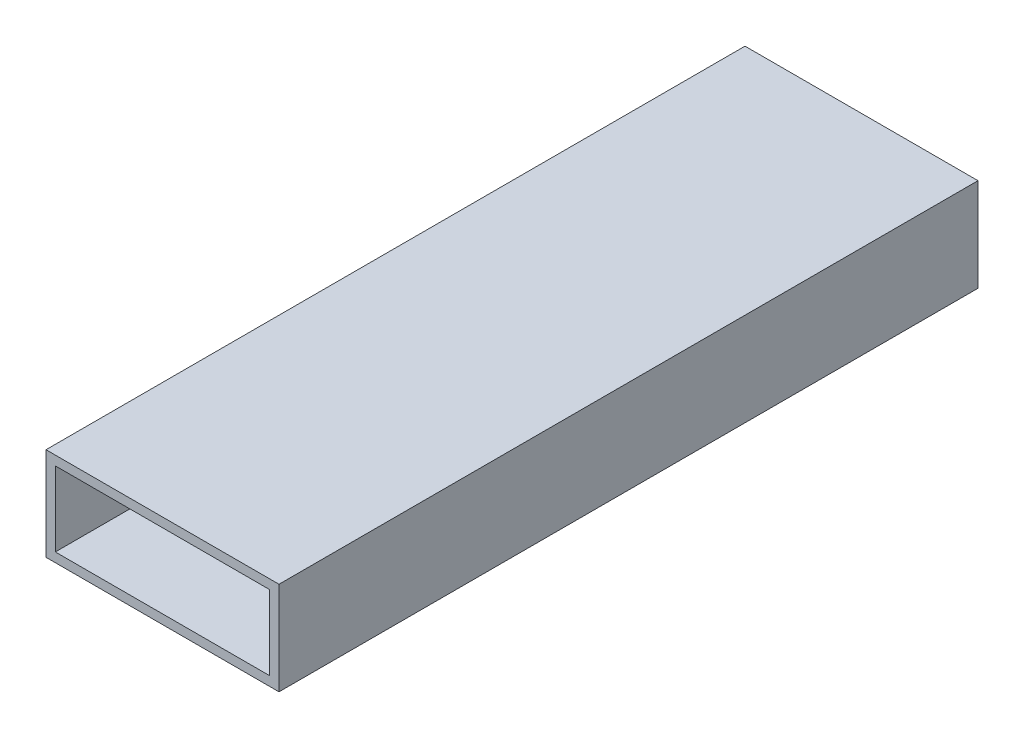
ISO-10303-21;
HEADER;
FILE_DESCRIPTION(('STEP AP214'),'2;1');
FILE_NAME('part.step','',(''),(''),'','','');
FILE_SCHEMA(('AUTOMOTIVE_DESIGN { 1 0 10303 214 1 1 1 1 }'));
ENDSEC;
DATA;
#1=APPLICATION_CONTEXT('core data for automotive mechanical design processes');
#2=APPLICATION_PROTOCOL_DEFINITION('international standard','automotive_design',2000,#1);
#3=PRODUCT_CONTEXT('',#1,'mechanical');
#4=PRODUCT('Part','Part','',(#3));
#5=PRODUCT_RELATED_PRODUCT_CATEGORY('part','',(#4));
#6=PRODUCT_DEFINITION_FORMATION('','',#4);
#7=PRODUCT_DEFINITION_CONTEXT('part definition',#1,'design');
#8=PRODUCT_DEFINITION('design','',#6,#7);
#9=PRODUCT_DEFINITION_SHAPE('','',#8);
#10=(LENGTH_UNIT() NAMED_UNIT(*) SI_UNIT(.MILLI.,.METRE.));
#11=(NAMED_UNIT(*) PLANE_ANGLE_UNIT() SI_UNIT($,.RADIAN.));
#12=(NAMED_UNIT(*) SI_UNIT($,.STERADIAN.) SOLID_ANGLE_UNIT());
#13=UNCERTAINTY_MEASURE_WITH_UNIT(LENGTH_MEASURE(1.E-05),#10,'distance_accuracy_value','');
#14=(GEOMETRIC_REPRESENTATION_CONTEXT(3) GLOBAL_UNCERTAINTY_ASSIGNED_CONTEXT((#13)) GLOBAL_UNIT_ASSIGNED_CONTEXT((#10,
#11,#12)) REPRESENTATION_CONTEXT('',''));
#15=CARTESIAN_POINT('',(0.,0.,0.));
#16=DIRECTION('',(0.,0.,1.));
#17=DIRECTION('',(1.,0.,0.));
#18=AXIS2_PLACEMENT_3D('',#15,#16,#17);
#19=CARTESIAN_POINT('',(0.,0.,150.));
#20=DIRECTION('',(0.,0.,-1.));
#21=DIRECTION('',(-1.,0.,0.));
#22=AXIS2_PLACEMENT_3D('',#19,#20,#21);
#23=PLANE('',#22);
#24=DIRECTION('',(0.,-1.,0.));
#25=VECTOR('',#24,1.);
#26=CARTESIAN_POINT('',(0.,0.,150.));
#27=LINE('',#26,#25);
#28=CARTESIAN_POINT('',(0.,20.,150.));
#29=VERTEX_POINT('',#28);
#30=CARTESIAN_POINT('',(0.,0.,150.));
#31=VERTEX_POINT('',#30);
#32=EDGE_CURVE('E136',#29,#31,#27,.T.);
#33=ORIENTED_EDGE('',*,*,#32,.T.);
#34=DIRECTION('',(1.,0.,0.));
#35=VECTOR('',#34,1.);
#36=CARTESIAN_POINT('',(0.,0.,150.));
#37=LINE('',#36,#35);
#38=CARTESIAN_POINT('',(50.,0.,150.));
#39=VERTEX_POINT('',#38);
#40=EDGE_CURVE('E139',#31,#39,#37,.T.);
#41=ORIENTED_EDGE('',*,*,#40,.T.);
#42=DIRECTION('',(0.,1.,0.));
#43=VECTOR('',#42,1.);
#44=CARTESIAN_POINT('',(50.,0.,150.));
#45=LINE('',#44,#43);
#46=CARTESIAN_POINT('',(50.,20.,150.));
#47=VERTEX_POINT('',#46);
#48=EDGE_CURVE('E142',#39,#47,#45,.T.);
#49=ORIENTED_EDGE('',*,*,#48,.T.);
#50=DIRECTION('',(-1.,0.,0.));
#51=VECTOR('',#50,1.);
#52=CARTESIAN_POINT('',(0.,20.,150.));
#53=LINE('',#52,#51);
#54=EDGE_CURVE('E144',#47,#29,#53,.T.);
#55=ORIENTED_EDGE('',*,*,#54,.T.);
#56=EDGE_LOOP('',(#33,#41,#49,#55));
#57=FACE_BOUND('',#56,.T.);
#58=DIRECTION('',(0.,-1.,0.));
#59=VECTOR('',#58,1.);
#60=CARTESIAN_POINT('',(2.,0.,150.));
#61=LINE('',#60,#59);
#62=CARTESIAN_POINT('',(1.99999999999999,18.,150.));
#63=VERTEX_POINT('',#62);
#64=CARTESIAN_POINT('',(2.,2.,150.));
#65=VERTEX_POINT('',#64);
#66=EDGE_CURVE('E124',#63,#65,#61,.T.);
#67=ORIENTED_EDGE('',*,*,#66,.F.);
#68=DIRECTION('',(-1.,0.,0.));
#69=VECTOR('',#68,1.);
#70=CARTESIAN_POINT('',(0.,18.,150.));
#71=LINE('',#70,#69);
#72=CARTESIAN_POINT('',(48.,18.,150.));
#73=VERTEX_POINT('',#72);
#74=EDGE_CURVE('E109',#73,#63,#71,.T.);
#75=ORIENTED_EDGE('',*,*,#74,.F.);
#76=DIRECTION('',(0.,1.,0.));
#77=VECTOR('',#76,1.);
#78=CARTESIAN_POINT('',(48.,0.,150.));
#79=LINE('',#78,#77);
#80=CARTESIAN_POINT('',(48.,2.,150.));
#81=VERTEX_POINT('',#80);
#82=EDGE_CURVE('E133',#81,#73,#79,.T.);
#83=ORIENTED_EDGE('',*,*,#82,.F.);
#84=DIRECTION('',(1.,0.,0.));
#85=VECTOR('',#84,1.);
#86=CARTESIAN_POINT('',(0.,2.,150.));
#87=LINE('',#86,#85);
#88=EDGE_CURVE('E126',#65,#81,#87,.T.);
#89=ORIENTED_EDGE('',*,*,#88,.F.);
#90=EDGE_LOOP('',(#67,#75,#83,#89));
#91=FACE_BOUND('',#90,.T.);
#92=ADVANCED_FACE('F39',(#57,#91),#23,.F.);
#93=CARTESIAN_POINT('',(0.,0.,0.));
#94=DIRECTION('',(0.,0.,-1.));
#95=DIRECTION('',(-1.,0.,0.));
#96=AXIS2_PLACEMENT_3D('',#93,#94,#95);
#97=PLANE('',#96);
#98=DIRECTION('',(0.,-1.,0.));
#99=VECTOR('',#98,1.);
#100=CARTESIAN_POINT('',(0.,0.,0.));
#101=LINE('',#100,#99);
#102=CARTESIAN_POINT('',(0.,20.,0.));
#103=VERTEX_POINT('',#102);
#104=CARTESIAN_POINT('',(0.,0.,0.));
#105=VERTEX_POINT('',#104);
#106=EDGE_CURVE('E147',#103,#105,#101,.T.);
#107=ORIENTED_EDGE('',*,*,#106,.F.);
#108=DIRECTION('',(-1.,0.,0.));
#109=VECTOR('',#108,1.);
#110=CARTESIAN_POINT('',(0.,20.,0.));
#111=LINE('',#110,#109);
#112=CARTESIAN_POINT('',(50.,20.,0.));
#113=VERTEX_POINT('',#112);
#114=EDGE_CURVE('E140',#113,#103,#111,.T.);
#115=ORIENTED_EDGE('',*,*,#114,.F.);
#116=DIRECTION('',(0.,1.,0.));
#117=VECTOR('',#116,1.);
#118=CARTESIAN_POINT('',(50.,0.,0.));
#119=LINE('',#118,#117);
#120=CARTESIAN_POINT('',(50.,0.,0.));
#121=VERTEX_POINT('',#120);
#122=EDGE_CURVE('E152',#121,#113,#119,.T.);
#123=ORIENTED_EDGE('',*,*,#122,.F.);
#124=DIRECTION('',(1.,0.,0.));
#125=VECTOR('',#124,1.);
#126=CARTESIAN_POINT('',(0.,0.,0.));
#127=LINE('',#126,#125);
#128=EDGE_CURVE('E150',#105,#121,#127,.T.);
#129=ORIENTED_EDGE('',*,*,#128,.F.);
#130=EDGE_LOOP('',(#107,#115,#123,#129));
#131=FACE_BOUND('',#130,.T.);
#132=DIRECTION('',(-1.,0.,0.));
#133=VECTOR('',#132,1.);
#134=CARTESIAN_POINT('',(0.,18.,0.));
#135=LINE('',#134,#133);
#136=CARTESIAN_POINT('',(48.,18.,0.));
#137=VERTEX_POINT('',#136);
#138=CARTESIAN_POINT('',(1.99999999999999,18.,0.));
#139=VERTEX_POINT('',#138);
#140=EDGE_CURVE('E107',#137,#139,#135,.T.);
#141=ORIENTED_EDGE('',*,*,#140,.T.);
#142=DIRECTION('',(0.,-1.,0.));
#143=VECTOR('',#142,1.);
#144=CARTESIAN_POINT('',(2.,0.,0.));
#145=LINE('',#144,#143);
#146=CARTESIAN_POINT('',(2.,2.,0.));
#147=VERTEX_POINT('',#146);
#148=EDGE_CURVE('E115',#139,#147,#145,.T.);
#149=ORIENTED_EDGE('',*,*,#148,.T.);
#150=DIRECTION('',(1.,0.,0.));
#151=VECTOR('',#150,1.);
#152=CARTESIAN_POINT('',(0.,2.,0.));
#153=LINE('',#152,#151);
#154=CARTESIAN_POINT('',(48.,2.,0.));
#155=VERTEX_POINT('',#154);
#156=EDGE_CURVE('E121',#147,#155,#153,.T.);
#157=ORIENTED_EDGE('',*,*,#156,.T.);
#158=DIRECTION('',(0.,1.,0.));
#159=VECTOR('',#158,1.);
#160=CARTESIAN_POINT('',(48.,0.,0.));
#161=LINE('',#160,#159);
#162=EDGE_CURVE('E61',#155,#137,#161,.T.);
#163=ORIENTED_EDGE('',*,*,#162,.T.);
#164=EDGE_LOOP('',(#141,#149,#157,#163));
#165=FACE_BOUND('',#164,.T.);
#166=ADVANCED_FACE('F123',(#131,#165),#97,.T.);
#167=CARTESIAN_POINT('',(0.,0.,150.));
#168=DIRECTION('',(1.,0.,0.));
#169=DIRECTION('',(0.,1.,0.));
#170=AXIS2_PLACEMENT_3D('',#167,#168,#169);
#171=PLANE('',#170);
#172=ORIENTED_EDGE('',*,*,#106,.T.);
#173=DIRECTION('',(0.,0.,-1.));
#174=VECTOR('',#173,1.);
#175=CARTESIAN_POINT('',(0.,0.,150.));
#176=LINE('',#175,#174);
#177=EDGE_CURVE('E11',#31,#105,#176,.T.);
#178=ORIENTED_EDGE('',*,*,#177,.F.);
#179=ORIENTED_EDGE('',*,*,#32,.F.);
#180=DIRECTION('',(0.,0.,-1.));
#181=VECTOR('',#180,1.);
#182=CARTESIAN_POINT('',(0.,20.,150.));
#183=LINE('',#182,#181);
#184=EDGE_CURVE('E146',#29,#103,#183,.T.);
#185=ORIENTED_EDGE('',*,*,#184,.T.);
#186=EDGE_LOOP('',(#172,#178,#179,#185));
#187=FACE_BOUND('',#186,.T.);
#188=ADVANCED_FACE('F41',(#187),#171,.F.);
#189=CARTESIAN_POINT('',(0.,0.,150.));
#190=DIRECTION('',(0.,1.,0.));
#191=DIRECTION('',(0.,0.,1.));
#192=AXIS2_PLACEMENT_3D('',#189,#190,#191);
#193=PLANE('',#192);
#194=ORIENTED_EDGE('',*,*,#128,.T.);
#195=DIRECTION('',(0.,0.,-1.));
#196=VECTOR('',#195,1.);
#197=CARTESIAN_POINT('',(50.,0.,150.));
#198=LINE('',#197,#196);
#199=EDGE_CURVE('E47',#39,#121,#198,.T.);
#200=ORIENTED_EDGE('',*,*,#199,.F.);
#201=ORIENTED_EDGE('',*,*,#40,.F.);
#202=ORIENTED_EDGE('',*,*,#177,.T.);
#203=EDGE_LOOP('',(#194,#200,#201,#202));
#204=FACE_BOUND('',#203,.T.);
#205=ADVANCED_FACE('F179',(#204),#193,.F.);
#206=CARTESIAN_POINT('',(50.,0.,150.));
#207=DIRECTION('',(-1.,0.,0.));
#208=DIRECTION('',(0.,-1.,0.));
#209=AXIS2_PLACEMENT_3D('',#206,#207,#208);
#210=PLANE('',#209);
#211=ORIENTED_EDGE('',*,*,#122,.T.);
#212=DIRECTION('',(0.,0.,-1.));
#213=VECTOR('',#212,1.);
#214=CARTESIAN_POINT('',(50.,20.,150.));
#215=LINE('',#214,#213);
#216=EDGE_CURVE('E157',#47,#113,#215,.T.);
#217=ORIENTED_EDGE('',*,*,#216,.F.);
#218=ORIENTED_EDGE('',*,*,#48,.F.);
#219=ORIENTED_EDGE('',*,*,#199,.T.);
#220=EDGE_LOOP('',(#211,#217,#218,#219));
#221=FACE_BOUND('',#220,.T.);
#222=ADVANCED_FACE('F164',(#221),#210,.F.);
#223=CARTESIAN_POINT('',(0.,20.,150.));
#224=DIRECTION('',(0.,-1.,0.));
#225=DIRECTION('',(0.,0.,-1.));
#226=AXIS2_PLACEMENT_3D('',#223,#224,#225);
#227=PLANE('',#226);
#228=ORIENTED_EDGE('',*,*,#114,.T.);
#229=ORIENTED_EDGE('',*,*,#184,.F.);
#230=ORIENTED_EDGE('',*,*,#54,.F.);
#231=ORIENTED_EDGE('',*,*,#216,.T.);
#232=EDGE_LOOP('',(#228,#229,#230,#231));
#233=FACE_BOUND('',#232,.T.);
#234=ADVANCED_FACE('F172',(#233),#227,.F.);
#235=CARTESIAN_POINT('',(2.,0.,150.));
#236=DIRECTION('',(1.,0.,0.));
#237=DIRECTION('',(0.,1.,0.));
#238=AXIS2_PLACEMENT_3D('',#235,#236,#237);
#239=PLANE('',#238);
#240=ORIENTED_EDGE('',*,*,#148,.F.);
#241=DIRECTION('',(0.,0.,-1.));
#242=VECTOR('',#241,1.);
#243=CARTESIAN_POINT('',(1.99999999999999,18.,150.));
#244=LINE('',#243,#242);
#245=EDGE_CURVE('E103',#63,#139,#244,.T.);
#246=ORIENTED_EDGE('',*,*,#245,.F.);
#247=ORIENTED_EDGE('',*,*,#66,.T.);
#248=DIRECTION('',(0.,0.,-1.));
#249=VECTOR('',#248,1.);
#250=CARTESIAN_POINT('',(2.,2.,150.));
#251=LINE('',#250,#249);
#252=EDGE_CURVE('E118',#65,#147,#251,.T.);
#253=ORIENTED_EDGE('',*,*,#252,.T.);
#254=EDGE_LOOP('',(#240,#246,#247,#253));
#255=FACE_BOUND('',#254,.T.);
#256=ADVANCED_FACE('F116',(#255),#239,.T.);
#257=CARTESIAN_POINT('',(0.,2.,150.));
#258=DIRECTION('',(0.,1.,0.));
#259=DIRECTION('',(0.,0.,1.));
#260=AXIS2_PLACEMENT_3D('',#257,#258,#259);
#261=PLANE('',#260);
#262=ORIENTED_EDGE('',*,*,#156,.F.);
#263=ORIENTED_EDGE('',*,*,#252,.F.);
#264=ORIENTED_EDGE('',*,*,#88,.T.);
#265=DIRECTION('',(0.,0.,-1.));
#266=VECTOR('',#265,1.);
#267=CARTESIAN_POINT('',(48.,2.,150.));
#268=LINE('',#267,#266);
#269=EDGE_CURVE('E262',#81,#155,#268,.T.);
#270=ORIENTED_EDGE('',*,*,#269,.T.);
#271=EDGE_LOOP('',(#262,#263,#264,#270));
#272=FACE_BOUND('',#271,.T.);
#273=ADVANCED_FACE('F199',(#272),#261,.T.);
#274=CARTESIAN_POINT('',(48.,0.,150.));
#275=DIRECTION('',(-1.,0.,0.));
#276=DIRECTION('',(0.,-1.,0.));
#277=AXIS2_PLACEMENT_3D('',#274,#275,#276);
#278=PLANE('',#277);
#279=ORIENTED_EDGE('',*,*,#162,.F.);
#280=ORIENTED_EDGE('',*,*,#269,.F.);
#281=ORIENTED_EDGE('',*,*,#82,.T.);
#282=DIRECTION('',(0.,0.,-1.));
#283=VECTOR('',#282,1.);
#284=CARTESIAN_POINT('',(48.,18.,150.));
#285=LINE('',#284,#283);
#286=EDGE_CURVE('E54',#73,#137,#285,.T.);
#287=ORIENTED_EDGE('',*,*,#286,.T.);
#288=EDGE_LOOP('',(#279,#280,#281,#287));
#289=FACE_BOUND('',#288,.T.);
#290=ADVANCED_FACE('F204',(#289),#278,.T.);
#291=CARTESIAN_POINT('',(0.,18.,150.));
#292=DIRECTION('',(0.,-1.,0.));
#293=DIRECTION('',(0.,0.,-1.));
#294=AXIS2_PLACEMENT_3D('',#291,#292,#293);
#295=PLANE('',#294);
#296=ORIENTED_EDGE('',*,*,#140,.F.);
#297=ORIENTED_EDGE('',*,*,#286,.F.);
#298=ORIENTED_EDGE('',*,*,#74,.T.);
#299=ORIENTED_EDGE('',*,*,#245,.T.);
#300=EDGE_LOOP('',(#296,#297,#298,#299));
#301=FACE_BOUND('',#300,.T.);
#302=ADVANCED_FACE('F105',(#301),#295,.T.);
#303=CLOSED_SHELL('',(#92,#166,#188,#205,#222,#234,#256,#273,#290,#302));
#304=MANIFOLD_SOLID_BREP('B2',#303);
#305=ADVANCED_BREP_SHAPE_REPRESENTATION('',(#18,#304),#14);
#306=SHAPE_DEFINITION_REPRESENTATION(#9,#305);
ENDSEC;
END-ISO-10303-21;
